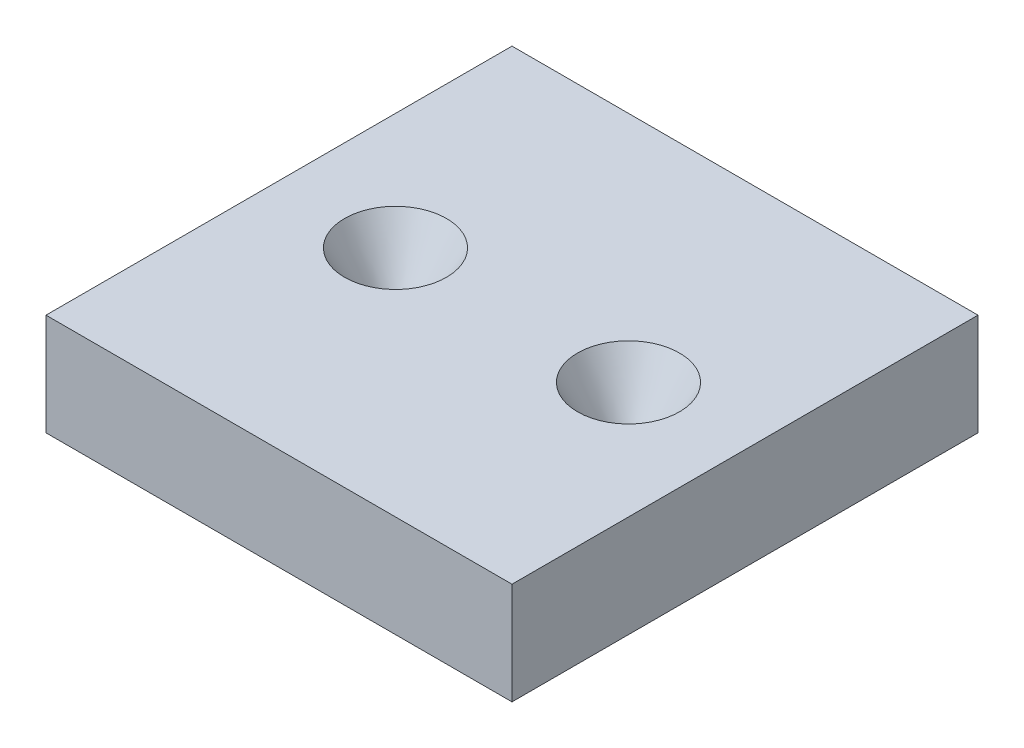
ISO-10303-21;
HEADER;
FILE_DESCRIPTION(('STEP AP214'),'2;1');
FILE_NAME('part.step','',(''),(''),'','','');
FILE_SCHEMA(('AUTOMOTIVE_DESIGN { 1 0 10303 214 1 1 1 1 }'));
ENDSEC;
DATA;
#1=APPLICATION_CONTEXT('core data for automotive mechanical design processes');
#2=APPLICATION_PROTOCOL_DEFINITION('international standard','automotive_design',2000,#1);
#3=PRODUCT_CONTEXT('',#1,'mechanical');
#4=PRODUCT('Part','Part','',(#3));
#5=PRODUCT_RELATED_PRODUCT_CATEGORY('part','',(#4));
#6=PRODUCT_DEFINITION_FORMATION('','',#4);
#7=PRODUCT_DEFINITION_CONTEXT('part definition',#1,'design');
#8=PRODUCT_DEFINITION('design','',#6,#7);
#9=PRODUCT_DEFINITION_SHAPE('','',#8);
#10=(LENGTH_UNIT() NAMED_UNIT(*) SI_UNIT(.MILLI.,.METRE.));
#11=(NAMED_UNIT(*) PLANE_ANGLE_UNIT() SI_UNIT($,.RADIAN.));
#12=(NAMED_UNIT(*) SI_UNIT($,.STERADIAN.) SOLID_ANGLE_UNIT());
#13=UNCERTAINTY_MEASURE_WITH_UNIT(LENGTH_MEASURE(1.E-05),#10,'distance_accuracy_value','');
#14=(GEOMETRIC_REPRESENTATION_CONTEXT(3) GLOBAL_UNCERTAINTY_ASSIGNED_CONTEXT((#13)) GLOBAL_UNIT_ASSIGNED_CONTEXT((#10,
#11,#12)) REPRESENTATION_CONTEXT('',''));
#15=CARTESIAN_POINT('',(0.,0.,0.));
#16=DIRECTION('',(0.,0.,1.));
#17=DIRECTION('',(1.,0.,0.));
#18=AXIS2_PLACEMENT_3D('',#15,#16,#17);
#19=CARTESIAN_POINT('',(-16.,3.5,-16.));
#20=DIRECTION('',(1.,0.,0.));
#21=DIRECTION('',(0.,0.,-1.));
#22=AXIS2_PLACEMENT_3D('',#19,#20,#21);
#23=PLANE('',#22);
#24=DIRECTION('',(0.,0.,1.));
#25=VECTOR('',#24,1.);
#26=CARTESIAN_POINT('',(-16.,-3.5,-16.));
#27=LINE('',#26,#25);
#28=CARTESIAN_POINT('',(-16.,-3.5,-16.));
#29=VERTEX_POINT('',#28);
#30=CARTESIAN_POINT('',(-16.,-3.5,16.));
#31=VERTEX_POINT('',#30);
#32=EDGE_CURVE('E104',#29,#31,#27,.T.);
#33=ORIENTED_EDGE('',*,*,#32,.T.);
#34=DIRECTION('',(0.,-1.,0.));
#35=VECTOR('',#34,1.);
#36=CARTESIAN_POINT('',(-16.,3.5,16.));
#37=LINE('',#36,#35);
#38=CARTESIAN_POINT('',(-16.,3.5,16.));
#39=VERTEX_POINT('',#38);
#40=EDGE_CURVE('E11',#39,#31,#37,.T.);
#41=ORIENTED_EDGE('',*,*,#40,.F.);
#42=DIRECTION('',(0.,0.,1.));
#43=VECTOR('',#42,1.);
#44=CARTESIAN_POINT('',(-16.,3.5,-16.));
#45=LINE('',#44,#43);
#46=CARTESIAN_POINT('',(-16.,3.5,-16.));
#47=VERTEX_POINT('',#46);
#48=EDGE_CURVE('E92',#47,#39,#45,.T.);
#49=ORIENTED_EDGE('',*,*,#48,.F.);
#50=DIRECTION('',(0.,-1.,0.));
#51=VECTOR('',#50,1.);
#52=CARTESIAN_POINT('',(-16.,3.5,-16.));
#53=LINE('',#52,#51);
#54=EDGE_CURVE('E100',#47,#29,#53,.T.);
#55=ORIENTED_EDGE('',*,*,#54,.T.);
#56=EDGE_LOOP('',(#33,#41,#49,#55));
#57=FACE_BOUND('',#56,.T.);
#58=ADVANCED_FACE('F41',(#57),#23,.F.);
#59=CARTESIAN_POINT('',(16.,3.5,16.));
#60=DIRECTION('',(0.,0.,-1.));
#61=DIRECTION('',(-1.,0.,0.));
#62=AXIS2_PLACEMENT_3D('',#59,#60,#61);
#63=PLANE('',#62);
#64=DIRECTION('',(1.,0.,0.));
#65=VECTOR('',#64,1.);
#66=CARTESIAN_POINT('',(16.,-3.5,16.));
#67=LINE('',#66,#65);
#68=CARTESIAN_POINT('',(16.,-3.5,16.));
#69=VERTEX_POINT('',#68);
#70=EDGE_CURVE('E96',#31,#69,#67,.T.);
#71=ORIENTED_EDGE('',*,*,#70,.T.);
#72=DIRECTION('',(0.,-1.,0.));
#73=VECTOR('',#72,1.);
#74=CARTESIAN_POINT('',(16.,3.5,16.));
#75=LINE('',#74,#73);
#76=CARTESIAN_POINT('',(16.,3.5,16.));
#77=VERTEX_POINT('',#76);
#78=EDGE_CURVE('E49',#77,#69,#75,.T.);
#79=ORIENTED_EDGE('',*,*,#78,.F.);
#80=DIRECTION('',(1.,0.,0.));
#81=VECTOR('',#80,1.);
#82=CARTESIAN_POINT('',(16.,3.5,16.));
#83=LINE('',#82,#81);
#84=EDGE_CURVE('E87',#39,#77,#83,.T.);
#85=ORIENTED_EDGE('',*,*,#84,.F.);
#86=ORIENTED_EDGE('',*,*,#40,.T.);
#87=EDGE_LOOP('',(#71,#79,#85,#86));
#88=FACE_BOUND('',#87,.T.);
#89=ADVANCED_FACE('F95',(#88),#63,.F.);
#90=CARTESIAN_POINT('',(16.,3.5,-16.));
#91=DIRECTION('',(-1.,0.,0.));
#92=DIRECTION('',(0.,0.,1.));
#93=AXIS2_PLACEMENT_3D('',#90,#91,#92);
#94=PLANE('',#93);
#95=DIRECTION('',(0.,0.,-1.));
#96=VECTOR('',#95,1.);
#97=CARTESIAN_POINT('',(16.,-3.5,-16.));
#98=LINE('',#97,#96);
#99=CARTESIAN_POINT('',(16.,-3.5,-16.));
#100=VERTEX_POINT('',#99);
#101=EDGE_CURVE('E74',#69,#100,#98,.T.);
#102=ORIENTED_EDGE('',*,*,#101,.T.);
#103=DIRECTION('',(0.,-1.,0.));
#104=VECTOR('',#103,1.);
#105=CARTESIAN_POINT('',(16.,3.5,-16.));
#106=LINE('',#105,#104);
#107=CARTESIAN_POINT('',(16.,3.5,-16.));
#108=VERTEX_POINT('',#107);
#109=EDGE_CURVE('E97',#108,#100,#106,.T.);
#110=ORIENTED_EDGE('',*,*,#109,.F.);
#111=DIRECTION('',(0.,0.,-1.));
#112=VECTOR('',#111,1.);
#113=CARTESIAN_POINT('',(16.,3.5,-16.));
#114=LINE('',#113,#112);
#115=EDGE_CURVE('E90',#77,#108,#114,.T.);
#116=ORIENTED_EDGE('',*,*,#115,.F.);
#117=ORIENTED_EDGE('',*,*,#78,.T.);
#118=EDGE_LOOP('',(#102,#110,#116,#117));
#119=FACE_BOUND('',#118,.T.);
#120=ADVANCED_FACE('F98',(#119),#94,.F.);
#121=CARTESIAN_POINT('',(16.,3.5,-16.));
#122=DIRECTION('',(0.,0.,1.));
#123=DIRECTION('',(1.,0.,0.));
#124=AXIS2_PLACEMENT_3D('',#121,#122,#123);
#125=PLANE('',#124);
#126=DIRECTION('',(-1.,0.,0.));
#127=VECTOR('',#126,1.);
#128=CARTESIAN_POINT('',(16.,-3.5,-16.));
#129=LINE('',#128,#127);
#130=EDGE_CURVE('E80',#100,#29,#129,.T.);
#131=ORIENTED_EDGE('',*,*,#130,.T.);
#132=ORIENTED_EDGE('',*,*,#54,.F.);
#133=DIRECTION('',(-1.,0.,0.));
#134=VECTOR('',#133,1.);
#135=CARTESIAN_POINT('',(16.,3.5,-16.));
#136=LINE('',#135,#134);
#137=EDGE_CURVE('E57',#108,#47,#136,.T.);
#138=ORIENTED_EDGE('',*,*,#137,.F.);
#139=ORIENTED_EDGE('',*,*,#109,.T.);
#140=EDGE_LOOP('',(#131,#132,#138,#139));
#141=FACE_BOUND('',#140,.T.);
#142=ADVANCED_FACE('F112',(#141),#125,.F.);
#143=CARTESIAN_POINT('',(0.,3.5,0.));
#144=DIRECTION('',(0.,-1.,0.));
#145=DIRECTION('',(0.,0.,-1.));
#146=AXIS2_PLACEMENT_3D('',#143,#144,#145);
#147=PLANE('',#146);
#148=CARTESIAN_POINT('',(7.99999999999999,3.5,0.));
#149=DIRECTION('',(0.,1.,0.));
#150=DIRECTION('',(0.,0.,1.));
#151=AXIS2_PLACEMENT_3D('',#148,#149,#150);
#152=CIRCLE('',#151,3.5);
#153=CARTESIAN_POINT('',(7.99999999999999,3.5,3.5));
#154=VERTEX_POINT('',#153);
#155=EDGE_CURVE('E132',#154,#154,#152,.T.);
#156=ORIENTED_EDGE('',*,*,#155,.F.);
#157=EDGE_LOOP('',(#156));
#158=FACE_BOUND('',#157,.T.);
#159=CARTESIAN_POINT('',(-8.00000000000001,3.5,0.));
#160=DIRECTION('',(0.,1.,0.));
#161=DIRECTION('',(0.,0.,1.));
#162=AXIS2_PLACEMENT_3D('',#159,#160,#161);
#163=CIRCLE('',#162,3.5);
#164=CARTESIAN_POINT('',(-8.00000000000001,3.5,3.5));
#165=VERTEX_POINT('',#164);
#166=EDGE_CURVE('E123',#165,#165,#163,.T.);
#167=ORIENTED_EDGE('',*,*,#166,.F.);
#168=EDGE_LOOP('',(#167));
#169=FACE_BOUND('',#168,.T.);
#170=ORIENTED_EDGE('',*,*,#48,.T.);
#171=ORIENTED_EDGE('',*,*,#84,.T.);
#172=ORIENTED_EDGE('',*,*,#115,.T.);
#173=ORIENTED_EDGE('',*,*,#137,.T.);
#174=EDGE_LOOP('',(#170,#171,#172,#173));
#175=FACE_BOUND('',#174,.T.);
#176=ADVANCED_FACE('F88',(#158,#169,#175),#147,.F.);
#177=CARTESIAN_POINT('',(0.,-3.5,0.));
#178=DIRECTION('',(0.,-1.,0.));
#179=DIRECTION('',(0.,0.,-1.));
#180=AXIS2_PLACEMENT_3D('',#177,#178,#179);
#181=PLANE('',#180);
#182=CARTESIAN_POINT('',(7.99999999999999,-3.5,0.));
#183=DIRECTION('',(0.,1.,0.));
#184=DIRECTION('',(0.,0.,1.));
#185=AXIS2_PLACEMENT_3D('',#182,#183,#184);
#186=CIRCLE('',#185,0.899999999999998);
#187=CARTESIAN_POINT('',(7.99999999999999,-3.5,0.899999999999997));
#188=VERTEX_POINT('',#187);
#189=EDGE_CURVE('E126',#188,#188,#186,.T.);
#190=ORIENTED_EDGE('',*,*,#189,.T.);
#191=EDGE_LOOP('',(#190));
#192=FACE_BOUND('',#191,.T.);
#193=CARTESIAN_POINT('',(-8.00000000000001,-3.5,0.));
#194=DIRECTION('',(0.,1.,0.));
#195=DIRECTION('',(0.,0.,1.));
#196=AXIS2_PLACEMENT_3D('',#193,#194,#195);
#197=CIRCLE('',#196,0.899999999999998);
#198=CARTESIAN_POINT('',(-8.00000000000001,-3.5,0.899999999999998));
#199=VERTEX_POINT('',#198);
#200=EDGE_CURVE('E107',#199,#199,#197,.T.);
#201=ORIENTED_EDGE('',*,*,#200,.T.);
#202=EDGE_LOOP('',(#201));
#203=FACE_BOUND('',#202,.T.);
#204=ORIENTED_EDGE('',*,*,#32,.F.);
#205=ORIENTED_EDGE('',*,*,#130,.F.);
#206=ORIENTED_EDGE('',*,*,#101,.F.);
#207=ORIENTED_EDGE('',*,*,#70,.F.);
#208=EDGE_LOOP('',(#204,#205,#206,#207));
#209=FACE_BOUND('',#208,.T.);
#210=ADVANCED_FACE('F115',(#192,#203,#209),#181,.T.);
#211=CARTESIAN_POINT('',(-8.00000000000001,3.5,0.));
#212=DIRECTION('',(0.,1.,0.));
#213=DIRECTION('',(0.,0.,1.));
#214=AXIS2_PLACEMENT_3D('',#211,#212,#213);
#215=CYLINDRICAL_SURFACE('',#214,0.899999999999998);
#216=ORIENTED_EDGE('',*,*,#200,.F.);
#217=EDGE_LOOP('',(#216));
#218=FACE_BOUND('',#217,.T.);
#219=CARTESIAN_POINT('',(-8.00000000000001,-1.00333209967908,0.));
#220=DIRECTION('',(0.,1.,0.));
#221=DIRECTION('',(0.,0.,1.));
#222=AXIS2_PLACEMENT_3D('',#219,#220,#221);
#223=CIRCLE('',#222,0.899999999999999);
#224=CARTESIAN_POINT('',(-8.00000000000001,-1.00333209967908,0.899999999999999));
#225=VERTEX_POINT('',#224);
#226=EDGE_CURVE('E120',#225,#225,#223,.T.);
#227=ORIENTED_EDGE('',*,*,#226,.T.);
#228=EDGE_LOOP('',(#227));
#229=FACE_BOUND('',#228,.T.);
#230=ADVANCED_FACE('F146',(#218,#229),#215,.F.);
#231=CARTESIAN_POINT('',(-8.00000000000001,3.5,0.));
#232=DIRECTION('',(0.,1.,0.));
#233=DIRECTION('',(0.,0.,1.));
#234=AXIS2_PLACEMENT_3D('',#231,#232,#233);
#235=CONICAL_SURFACE('',#234,3.5,0.523598775598299);
#236=CARTESIAN_POINT('',(-8.00000000000001,-1.00333209967908,0.899999999999999));
#237=CARTESIAN_POINT('',(-8.00000000000001,-0.956422390307426,0.927083333333332));
#238=CARTESIAN_POINT('',(-8.00000000000001,-0.909512680935769,0.954166666666665));
#239=CARTESIAN_POINT('',(-8.00000000000001,-0.815693262192455,1.00833333333333));
#240=CARTESIAN_POINT('',(-8.00000000000001,-0.768783552820798,1.03541666666667));
#241=CARTESIAN_POINT('',(-8.00000000000001,-0.674964134077483,1.08958333333333));
#242=CARTESIAN_POINT('',(-8.00000000000001,-0.628054424705826,1.11666666666667));
#243=CARTESIAN_POINT('',(-8.00000000000001,-0.534235005962512,1.17083333333333));
#244=CARTESIAN_POINT('',(-8.00000000000001,-0.487325296590855,1.19791666666667));
#245=CARTESIAN_POINT('',(-8.00000000000001,-0.393505877847541,1.25208333333333));
#246=CARTESIAN_POINT('',(-8.00000000000001,-0.346596168475884,1.27916666666667));
#247=CARTESIAN_POINT('',(-8.00000000000001,-0.252776749732569,1.33333333333333));
#248=CARTESIAN_POINT('',(-8.00000000000001,-0.205867040360912,1.36041666666667));
#249=CARTESIAN_POINT('',(-8.00000000000001,-0.112047621617598,1.41458333333333));
#250=CARTESIAN_POINT('',(-8.00000000000001,-0.0651379122459408,1.44166666666667));
#251=CARTESIAN_POINT('',(-8.00000000000001,0.0286815064973734,1.49583333333333));
#252=CARTESIAN_POINT('',(-8.00000000000001,0.0755912158690306,1.52291666666667));
#253=CARTESIAN_POINT('',(-8.00000000000001,0.169410634612345,1.57708333333333));
#254=CARTESIAN_POINT('',(-8.00000000000001,0.216320343984002,1.60416666666667));
#255=CARTESIAN_POINT('',(-8.00000000000001,0.310139762727316,1.65833333333333));
#256=CARTESIAN_POINT('',(-8.00000000000001,0.357049472098973,1.68541666666667));
#257=CARTESIAN_POINT('',(-8.00000000000001,0.450868890842288,1.73958333333333));
#258=CARTESIAN_POINT('',(-8.00000000000001,0.497778600213945,1.76666666666667));
#259=CARTESIAN_POINT('',(-8.00000000000001,0.591598018957259,1.82083333333333));
#260=CARTESIAN_POINT('',(-8.00000000000001,0.638507728328916,1.84791666666667));
#261=CARTESIAN_POINT('',(-8.00000000000001,0.73232714707223,1.90208333333333));
#262=CARTESIAN_POINT('',(-8.00000000000001,0.779236856443887,1.92916666666667));
#263=CARTESIAN_POINT('',(-8.00000000000001,0.873056275187202,1.98333333333333));
#264=CARTESIAN_POINT('',(-8.00000000000001,0.919965984558859,2.01041666666667));
#265=CARTESIAN_POINT('',(-8.00000000000001,1.01378540330217,2.06458333333333));
#266=CARTESIAN_POINT('',(-8.00000000000001,1.06069511267383,2.09166666666667));
#267=CARTESIAN_POINT('',(-8.00000000000001,1.15451453141714,2.14583333333333));
#268=CARTESIAN_POINT('',(-8.00000000000001,1.2014242407888,2.17291666666667));
#269=CARTESIAN_POINT('',(-8.00000000000001,1.29524365953212,2.22708333333333));
#270=CARTESIAN_POINT('',(-8.00000000000001,1.34215336890377,2.25416666666667));
#271=CARTESIAN_POINT('',(-8.00000000000001,1.43597278764709,2.30833333333333));
#272=CARTESIAN_POINT('',(-8.00000000000001,1.48288249701874,2.33541666666667));
#273=CARTESIAN_POINT('',(-8.00000000000001,1.57670191576206,2.38958333333333));
#274=CARTESIAN_POINT('',(-8.00000000000001,1.62361162513372,2.41666666666667));
#275=CARTESIAN_POINT('',(-8.00000000000001,1.71743104387703,2.47083333333333));
#276=CARTESIAN_POINT('',(-8.00000000000001,1.76434075324869,2.49791666666667));
#277=CARTESIAN_POINT('',(-8.00000000000001,1.858160171992,2.55208333333333));
#278=CARTESIAN_POINT('',(-8.00000000000001,1.90506988136366,2.57916666666667));
#279=CARTESIAN_POINT('',(-8.00000000000001,1.99888930010697,2.63333333333333));
#280=CARTESIAN_POINT('',(-8.00000000000001,2.04579900947863,2.66041666666667));
#281=CARTESIAN_POINT('',(-8.00000000000001,2.13961842822194,2.71458333333333));
#282=CARTESIAN_POINT('',(-8.00000000000001,2.1865281375936,2.74166666666667));
#283=CARTESIAN_POINT('',(-8.00000000000001,2.28034755633692,2.79583333333333));
#284=CARTESIAN_POINT('',(-8.00000000000001,2.32725726570857,2.82291666666667));
#285=CARTESIAN_POINT('',(-8.00000000000001,2.42107668445189,2.87708333333333));
#286=CARTESIAN_POINT('',(-8.00000000000001,2.46798639382354,2.90416666666667));
#287=CARTESIAN_POINT('',(-8.00000000000001,2.56180581256686,2.95833333333333));
#288=CARTESIAN_POINT('',(-8.00000000000001,2.60871552193851,2.98541666666667));
#289=CARTESIAN_POINT('',(-8.00000000000001,2.70253494068183,3.03958333333333));
#290=CARTESIAN_POINT('',(-8.00000000000001,2.74944465005349,3.06666666666667));
#291=CARTESIAN_POINT('',(-8.00000000000001,2.8432640687968,3.12083333333333));
#292=CARTESIAN_POINT('',(-8.00000000000001,2.89017377816846,3.14791666666667));
#293=CARTESIAN_POINT('',(-8.00000000000001,2.98399319691177,3.20208333333333));
#294=CARTESIAN_POINT('',(-8.00000000000001,3.03090290628343,3.22916666666667));
#295=CARTESIAN_POINT('',(-8.00000000000001,3.12472232502674,3.28333333333333));
#296=CARTESIAN_POINT('',(-8.00000000000001,3.1716320343984,3.31041666666667));
#297=CARTESIAN_POINT('',(-8.00000000000001,3.26545145314171,3.36458333333333));
#298=CARTESIAN_POINT('',(-8.00000000000001,3.31236116251337,3.39166666666667));
#299=CARTESIAN_POINT('',(-8.00000000000001,3.40618058125669,3.44583333333333));
#300=CARTESIAN_POINT('',(-8.00000000000001,3.45309029062834,3.47291666666667));
#301=CARTESIAN_POINT('',(-8.00000000000001,3.5,3.5));
#302=B_SPLINE_CURVE_WITH_KNOTS('',3,(#236,#237,#238,#239,#240,#241,#242,#243,#244,#245,#246,
#247,#248,#249,#250,#251,#252,#253,#254,#255,#256,#257,#258,#259,#260,#261,#262,#263,#264,#265,
#266,#267,#268,#269,#270,#271,#272,#273,#274,#275,#276,#277,#278,#279,#280,#281,#282,#283,#284,
#285,#286,#287,#288,#289,#290,#291,#292,#293,#294,#295,#296,#297,#298,#299,#300,#301),
.UNSPECIFIED.,.F.,.F.,(4,2,2,2,2,2,2,2,2,2,2,2,2,2,2,2,2,2,2,2,2,2,2,2,2,2,2,2,2,2,2,2,4),(0.,
0.1625,0.325,0.487500000000001,0.65,0.812500000000001,0.975,1.1375,1.3,1.4625,1.625,1.7875,1.95,
2.1125,2.275,2.4375,2.6,2.7625,2.925,3.0875,3.25,3.4125,3.575,3.7375,3.9,4.0625,4.225,4.3875,
4.55,4.7125,4.875,5.0375,5.2),.UNSPECIFIED.);
#303=EDGE_CURVE('BSEAM143',#225,#165,#302,.T.);
#304=ORIENTED_EDGE('',*,*,#226,.F.);
#305=ORIENTED_EDGE('',*,*,#166,.T.);
#306=ORIENTED_EDGE('',*,*,#303,.T.);
#307=ORIENTED_EDGE('',*,*,#303,.F.);
#308=EDGE_LOOP('',(#304,#306,#305,#307));
#309=FACE_BOUND('',#308,.T.);
#310=ADVANCED_FACE('F143',(#309),#235,.F.);
#311=CARTESIAN_POINT('',(7.99999999999999,3.5,0.));
#312=DIRECTION('',(0.,1.,0.));
#313=DIRECTION('',(0.,0.,1.));
#314=AXIS2_PLACEMENT_3D('',#311,#312,#313);
#315=CYLINDRICAL_SURFACE('',#314,0.899999999999998);
#316=ORIENTED_EDGE('',*,*,#189,.F.);
#317=EDGE_LOOP('',(#316));
#318=FACE_BOUND('',#317,.T.);
#319=CARTESIAN_POINT('',(7.99999999999999,-1.00333209967908,0.));
#320=DIRECTION('',(0.,1.,0.));
#321=DIRECTION('',(0.,0.,1.));
#322=AXIS2_PLACEMENT_3D('',#319,#320,#321);
#323=CIRCLE('',#322,0.899999999999998);
#324=CARTESIAN_POINT('',(7.99999999999999,-1.00333209967908,0.899999999999997));
#325=VERTEX_POINT('',#324);
#326=EDGE_CURVE('E129',#325,#325,#323,.T.);
#327=ORIENTED_EDGE('',*,*,#326,.T.);
#328=EDGE_LOOP('',(#327));
#329=FACE_BOUND('',#328,.T.);
#330=ADVANCED_FACE('F145',(#318,#329),#315,.F.);
#331=CARTESIAN_POINT('',(7.99999999999999,3.5,0.));
#332=DIRECTION('',(0.,1.,0.));
#333=DIRECTION('',(0.,0.,1.));
#334=AXIS2_PLACEMENT_3D('',#331,#332,#333);
#335=CONICAL_SURFACE('',#334,3.5,0.523598775598299);
#336=CARTESIAN_POINT('',(7.99999999999999,-1.00333209967908,0.899999999999997));
#337=CARTESIAN_POINT('',(7.99999999999999,-0.956422390307426,0.92708333333333));
#338=CARTESIAN_POINT('',(7.99999999999999,-0.909512680935769,0.954166666666663));
#339=CARTESIAN_POINT('',(7.99999999999999,-0.815693262192455,1.00833333333333));
#340=CARTESIAN_POINT('',(7.99999999999999,-0.768783552820798,1.03541666666666));
#341=CARTESIAN_POINT('',(7.99999999999999,-0.674964134077483,1.08958333333333));
#342=CARTESIAN_POINT('',(7.99999999999999,-0.628054424705826,1.11666666666666));
#343=CARTESIAN_POINT('',(7.99999999999999,-0.534235005962512,1.17083333333333));
#344=CARTESIAN_POINT('',(7.99999999999999,-0.487325296590855,1.19791666666666));
#345=CARTESIAN_POINT('',(7.99999999999999,-0.393505877847541,1.25208333333333));
#346=CARTESIAN_POINT('',(7.99999999999999,-0.346596168475884,1.27916666666666));
#347=CARTESIAN_POINT('',(7.99999999999999,-0.252776749732569,1.33333333333333));
#348=CARTESIAN_POINT('',(7.99999999999999,-0.205867040360912,1.36041666666666));
#349=CARTESIAN_POINT('',(7.99999999999999,-0.112047621617598,1.41458333333333));
#350=CARTESIAN_POINT('',(7.99999999999999,-0.0651379122459408,1.44166666666666));
#351=CARTESIAN_POINT('',(7.99999999999999,0.0286815064973734,1.49583333333333));
#352=CARTESIAN_POINT('',(7.99999999999999,0.0755912158690305,1.52291666666666));
#353=CARTESIAN_POINT('',(7.99999999999999,0.169410634612345,1.57708333333333));
#354=CARTESIAN_POINT('',(7.99999999999999,0.216320343984002,1.60416666666666));
#355=CARTESIAN_POINT('',(7.99999999999999,0.310139762727316,1.65833333333333));
#356=CARTESIAN_POINT('',(7.99999999999999,0.357049472098973,1.68541666666666));
#357=CARTESIAN_POINT('',(7.99999999999999,0.450868890842287,1.73958333333333));
#358=CARTESIAN_POINT('',(7.99999999999999,0.497778600213945,1.76666666666666));
#359=CARTESIAN_POINT('',(7.99999999999999,0.591598018957259,1.82083333333333));
#360=CARTESIAN_POINT('',(7.99999999999999,0.638507728328916,1.84791666666666));
#361=CARTESIAN_POINT('',(7.99999999999999,0.73232714707223,1.90208333333333));
#362=CARTESIAN_POINT('',(7.99999999999999,0.779236856443887,1.92916666666666));
#363=CARTESIAN_POINT('',(7.99999999999999,0.873056275187201,1.98333333333333));
#364=CARTESIAN_POINT('',(7.99999999999999,0.919965984558859,2.01041666666666));
#365=CARTESIAN_POINT('',(7.99999999999999,1.01378540330217,2.06458333333333));
#366=CARTESIAN_POINT('',(7.99999999999999,1.06069511267383,2.09166666666666));
#367=CARTESIAN_POINT('',(7.99999999999999,1.15451453141714,2.14583333333333));
#368=CARTESIAN_POINT('',(7.99999999999999,1.2014242407888,2.17291666666666));
#369=CARTESIAN_POINT('',(7.99999999999999,1.29524365953212,2.22708333333333));
#370=CARTESIAN_POINT('',(7.99999999999999,1.34215336890377,2.25416666666666));
#371=CARTESIAN_POINT('',(7.99999999999999,1.43597278764709,2.30833333333333));
#372=CARTESIAN_POINT('',(7.99999999999999,1.48288249701874,2.33541666666666));
#373=CARTESIAN_POINT('',(7.99999999999999,1.57670191576206,2.38958333333333));
#374=CARTESIAN_POINT('',(7.99999999999999,1.62361162513372,2.41666666666666));
#375=CARTESIAN_POINT('',(7.99999999999999,1.71743104387703,2.47083333333333));
#376=CARTESIAN_POINT('',(7.99999999999999,1.76434075324869,2.49791666666666));
#377=CARTESIAN_POINT('',(7.99999999999999,1.858160171992,2.55208333333333));
#378=CARTESIAN_POINT('',(7.99999999999999,1.90506988136366,2.57916666666666));
#379=CARTESIAN_POINT('',(7.99999999999999,1.99888930010697,2.63333333333333));
#380=CARTESIAN_POINT('',(7.99999999999999,2.04579900947863,2.66041666666666));
#381=CARTESIAN_POINT('',(7.99999999999999,2.13961842822194,2.71458333333333));
#382=CARTESIAN_POINT('',(7.99999999999999,2.1865281375936,2.74166666666666));
#383=CARTESIAN_POINT('',(7.99999999999999,2.28034755633692,2.79583333333333));
#384=CARTESIAN_POINT('',(7.99999999999999,2.32725726570857,2.82291666666667));
#385=CARTESIAN_POINT('',(7.99999999999999,2.42107668445189,2.87708333333333));
#386=CARTESIAN_POINT('',(7.99999999999999,2.46798639382354,2.90416666666667));
#387=CARTESIAN_POINT('',(7.99999999999999,2.56180581256686,2.95833333333333));
#388=CARTESIAN_POINT('',(7.99999999999999,2.60871552193851,2.98541666666667));
#389=CARTESIAN_POINT('',(7.99999999999999,2.70253494068183,3.03958333333333));
#390=CARTESIAN_POINT('',(7.99999999999999,2.74944465005349,3.06666666666667));
#391=CARTESIAN_POINT('',(7.99999999999999,2.8432640687968,3.12083333333333));
#392=CARTESIAN_POINT('',(7.99999999999999,2.89017377816846,3.14791666666667));
#393=CARTESIAN_POINT('',(7.99999999999999,2.98399319691177,3.20208333333333));
#394=CARTESIAN_POINT('',(7.99999999999999,3.03090290628343,3.22916666666666));
#395=CARTESIAN_POINT('',(7.99999999999999,3.12472232502674,3.28333333333333));
#396=CARTESIAN_POINT('',(7.99999999999999,3.1716320343984,3.31041666666667));
#397=CARTESIAN_POINT('',(7.99999999999999,3.26545145314171,3.36458333333333));
#398=CARTESIAN_POINT('',(7.99999999999999,3.31236116251337,3.39166666666667));
#399=CARTESIAN_POINT('',(7.99999999999999,3.40618058125669,3.44583333333333));
#400=CARTESIAN_POINT('',(7.99999999999999,3.45309029062834,3.47291666666667));
#401=CARTESIAN_POINT('',(7.99999999999999,3.5,3.5));
#402=B_SPLINE_CURVE_WITH_KNOTS('',3,(#336,#337,#338,#339,#340,#341,#342,#343,#344,#345,#346,
#347,#348,#349,#350,#351,#352,#353,#354,#355,#356,#357,#358,#359,#360,#361,#362,#363,#364,#365,
#366,#367,#368,#369,#370,#371,#372,#373,#374,#375,#376,#377,#378,#379,#380,#381,#382,#383,#384,
#385,#386,#387,#388,#389,#390,#391,#392,#393,#394,#395,#396,#397,#398,#399,#400,#401),
.UNSPECIFIED.,.F.,.F.,(4,2,2,2,2,2,2,2,2,2,2,2,2,2,2,2,2,2,2,2,2,2,2,2,2,2,2,2,2,2,2,2,4),(0.,
0.162499999999999,0.325,0.487500000000001,0.65,0.8125,0.975,1.1375,1.3,1.4625,1.625,1.7875,1.95,
2.1125,2.275,2.4375,2.6,2.7625,2.925,3.0875,3.25,3.4125,3.575,3.7375,3.9,4.0625,4.225,4.3875,
4.55,4.7125,4.875,5.0375,5.2),.UNSPECIFIED.);
#403=EDGE_CURVE('BSEAM136',#325,#154,#402,.T.);
#404=ORIENTED_EDGE('',*,*,#326,.F.);
#405=ORIENTED_EDGE('',*,*,#155,.T.);
#406=ORIENTED_EDGE('',*,*,#403,.T.);
#407=ORIENTED_EDGE('',*,*,#403,.F.);
#408=EDGE_LOOP('',(#404,#406,#405,#407));
#409=FACE_BOUND('',#408,.T.);
#410=ADVANCED_FACE('F136',(#409),#335,.F.);
#411=CLOSED_SHELL('',(#58,#89,#120,#142,#176,#210,#230,#310,#330,#410));
#412=MANIFOLD_SOLID_BREP('B2',#411);
#413=ADVANCED_BREP_SHAPE_REPRESENTATION('',(#18,#412),#14);
#414=SHAPE_DEFINITION_REPRESENTATION(#9,#413);
ENDSEC;
END-ISO-10303-21;
